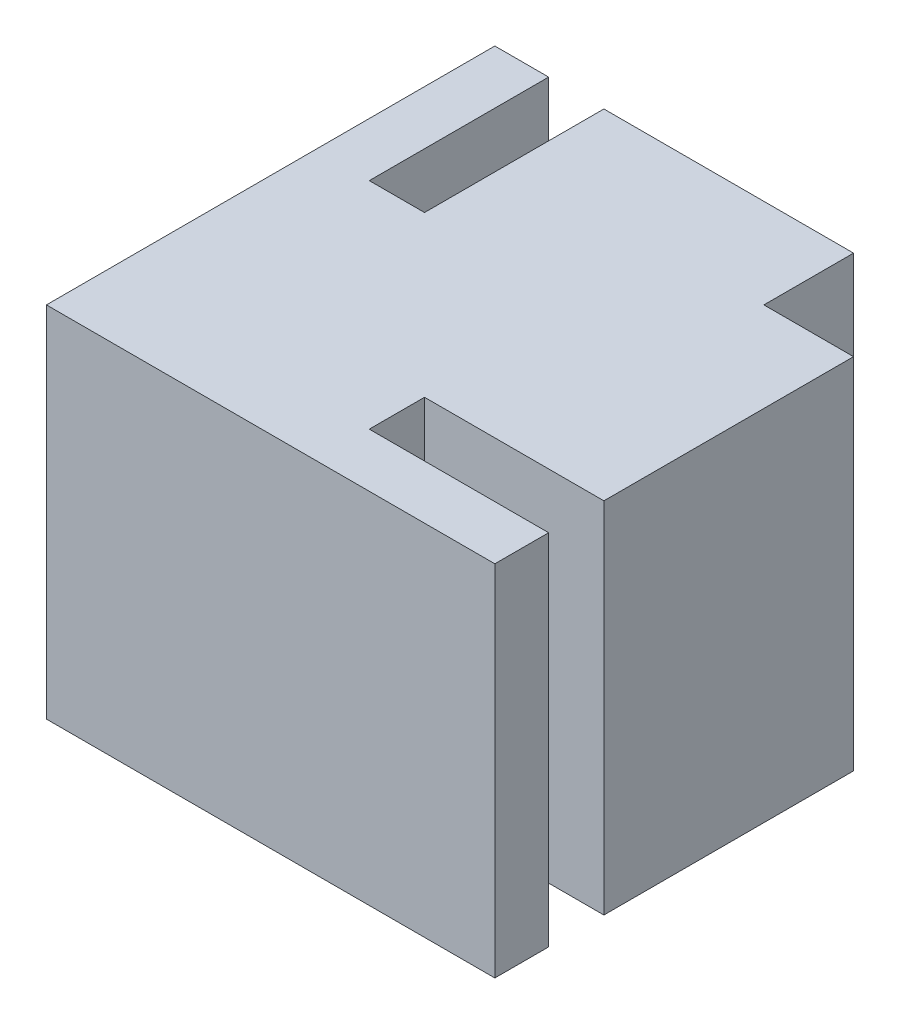
ISO-10303-21;
HEADER;
FILE_DESCRIPTION(('STEP AP214'),'2;1');
FILE_NAME('part.step','',(''),(''),'','','');
FILE_SCHEMA(('AUTOMOTIVE_DESIGN { 1 0 10303 214 1 1 1 1 }'));
ENDSEC;
DATA;
#1=APPLICATION_CONTEXT('core data for automotive mechanical design processes');
#2=APPLICATION_PROTOCOL_DEFINITION('international standard','automotive_design',2000,#1);
#3=PRODUCT_CONTEXT('',#1,'mechanical');
#4=PRODUCT('Part','Part','',(#3));
#5=PRODUCT_RELATED_PRODUCT_CATEGORY('part','',(#4));
#6=PRODUCT_DEFINITION_FORMATION('','',#4);
#7=PRODUCT_DEFINITION_CONTEXT('part definition',#1,'design');
#8=PRODUCT_DEFINITION('design','',#6,#7);
#9=PRODUCT_DEFINITION_SHAPE('','',#8);
#10=(LENGTH_UNIT() NAMED_UNIT(*) SI_UNIT(.MILLI.,.METRE.));
#11=(NAMED_UNIT(*) PLANE_ANGLE_UNIT() SI_UNIT($,.RADIAN.));
#12=(NAMED_UNIT(*) SI_UNIT($,.STERADIAN.) SOLID_ANGLE_UNIT());
#13=UNCERTAINTY_MEASURE_WITH_UNIT(LENGTH_MEASURE(1.E-05),#10,'distance_accuracy_value','');
#14=(GEOMETRIC_REPRESENTATION_CONTEXT(3) GLOBAL_UNCERTAINTY_ASSIGNED_CONTEXT((#13)) GLOBAL_UNIT_ASSIGNED_CONTEXT((#10,
#11,#12)) REPRESENTATION_CONTEXT('',''));
#15=CARTESIAN_POINT('',(0.,0.,0.));
#16=DIRECTION('',(0.,0.,1.));
#17=DIRECTION('',(1.,0.,0.));
#18=AXIS2_PLACEMENT_3D('',#15,#16,#17);
#19=CARTESIAN_POINT('',(12.5,20.,12.5));
#20=DIRECTION('',(-1.,0.,0.));
#21=DIRECTION('',(0.,0.,1.));
#22=AXIS2_PLACEMENT_3D('',#19,#20,#21);
#23=PLANE('',#22);
#24=DIRECTION('',(0.,0.,-1.));
#25=VECTOR('',#24,1.);
#26=CARTESIAN_POINT('',(12.5,0.,12.5));
#27=LINE('',#26,#25);
#28=CARTESIAN_POINT('',(12.5,0.,12.5));
#29=VERTEX_POINT('',#28);
#30=CARTESIAN_POINT('',(12.5,0.,9.5));
#31=VERTEX_POINT('',#30);
#32=EDGE_CURVE('E158',#29,#31,#27,.T.);
#33=ORIENTED_EDGE('',*,*,#32,.T.);
#34=DIRECTION('',(0.,1.,0.));
#35=VECTOR('',#34,1.);
#36=CARTESIAN_POINT('',(12.5,0.,9.5));
#37=LINE('',#36,#35);
#38=CARTESIAN_POINT('',(12.5,20.,9.5));
#39=VERTEX_POINT('',#38);
#40=EDGE_CURVE('E207',#31,#39,#37,.T.);
#41=ORIENTED_EDGE('',*,*,#40,.T.);
#42=DIRECTION('',(0.,0.,-1.));
#43=VECTOR('',#42,1.);
#44=CARTESIAN_POINT('',(12.5,20.,12.5));
#45=LINE('',#44,#43);
#46=CARTESIAN_POINT('',(12.5,20.,12.5));
#47=VERTEX_POINT('',#46);
#48=EDGE_CURVE('E192',#47,#39,#45,.T.);
#49=ORIENTED_EDGE('',*,*,#48,.F.);
#50=DIRECTION('',(0.,-1.,0.));
#51=VECTOR('',#50,1.);
#52=CARTESIAN_POINT('',(12.5,20.,12.5));
#53=LINE('',#52,#51);
#54=EDGE_CURVE('E41',#47,#29,#53,.T.);
#55=ORIENTED_EDGE('',*,*,#54,.T.);
#56=EDGE_LOOP('',(#33,#41,#49,#55));
#57=FACE_BOUND('',#56,.T.);
#58=ADVANCED_FACE('F33',(#57),#23,.F.);
#59=CARTESIAN_POINT('',(-12.5,20.,-12.5));
#60=DIRECTION('',(0.,0.,1.));
#61=DIRECTION('',(1.,0.,0.));
#62=AXIS2_PLACEMENT_3D('',#59,#60,#61);
#63=PLANE('',#62);
#64=DIRECTION('',(-1.,0.,0.));
#65=VECTOR('',#64,1.);
#66=CARTESIAN_POINT('',(-12.5,0.,-12.5));
#67=LINE('',#66,#65);
#68=CARTESIAN_POINT('',(7.5,0.,-12.5));
#69=VERTEX_POINT('',#68);
#70=CARTESIAN_POINT('',(-6.42,0.,-12.5));
#71=VERTEX_POINT('',#70);
#72=EDGE_CURVE('E170',#69,#71,#67,.T.);
#73=ORIENTED_EDGE('',*,*,#72,.T.);
#74=DIRECTION('',(0.,1.,0.));
#75=VECTOR('',#74,1.);
#76=CARTESIAN_POINT('',(-6.42,0.,-12.5));
#77=LINE('',#76,#75);
#78=CARTESIAN_POINT('',(-6.42,20.,-12.5));
#79=VERTEX_POINT('',#78);
#80=EDGE_CURVE('E220',#71,#79,#77,.T.);
#81=ORIENTED_EDGE('',*,*,#80,.T.);
#82=DIRECTION('',(-1.,0.,0.));
#83=VECTOR('',#82,1.);
#84=CARTESIAN_POINT('',(-12.5,20.,-12.5));
#85=LINE('',#84,#83);
#86=CARTESIAN_POINT('',(7.5,20.,-12.5));
#87=VERTEX_POINT('',#86);
#88=EDGE_CURVE('E178',#87,#79,#85,.T.);
#89=ORIENTED_EDGE('',*,*,#88,.F.);
#90=DIRECTION('',(0.,-1.,0.));
#91=VECTOR('',#90,1.);
#92=CARTESIAN_POINT('',(7.5,20.,-12.5));
#93=LINE('',#92,#91);
#94=EDGE_CURVE('E177',#87,#69,#93,.T.);
#95=ORIENTED_EDGE('',*,*,#94,.T.);
#96=EDGE_LOOP('',(#73,#81,#89,#95));
#97=FACE_BOUND('',#96,.T.);
#98=ADVANCED_FACE('F269',(#97),#63,.F.);
#99=CARTESIAN_POINT('',(-12.5,20.,12.5));
#100=DIRECTION('',(1.,0.,0.));
#101=DIRECTION('',(0.,0.,-1.));
#102=AXIS2_PLACEMENT_3D('',#99,#100,#101);
#103=PLANE('',#102);
#104=DIRECTION('',(0.,0.,1.));
#105=VECTOR('',#104,1.);
#106=CARTESIAN_POINT('',(-12.5,0.,12.5));
#107=LINE('',#106,#105);
#108=CARTESIAN_POINT('',(-12.5,0.,-12.5));
#109=VERTEX_POINT('',#108);
#110=CARTESIAN_POINT('',(-12.5,0.,12.5));
#111=VERTEX_POINT('',#110);
#112=EDGE_CURVE('E162',#109,#111,#107,.T.);
#113=ORIENTED_EDGE('',*,*,#112,.T.);
#114=DIRECTION('',(0.,-1.,0.));
#115=VECTOR('',#114,1.);
#116=CARTESIAN_POINT('',(-12.5,20.,12.5));
#117=LINE('',#116,#115);
#118=CARTESIAN_POINT('',(-12.5,20.,12.5));
#119=VERTEX_POINT('',#118);
#120=EDGE_CURVE('E11',#119,#111,#117,.T.);
#121=ORIENTED_EDGE('',*,*,#120,.F.);
#122=DIRECTION('',(0.,0.,1.));
#123=VECTOR('',#122,1.);
#124=CARTESIAN_POINT('',(-12.5,20.,12.5));
#125=LINE('',#124,#123);
#126=CARTESIAN_POINT('',(-12.5,20.,-12.5));
#127=VERTEX_POINT('',#126);
#128=EDGE_CURVE('E173',#127,#119,#125,.T.);
#129=ORIENTED_EDGE('',*,*,#128,.F.);
#130=DIRECTION('',(0.,-1.,0.));
#131=VECTOR('',#130,1.);
#132=CARTESIAN_POINT('',(-12.5,20.,-12.5));
#133=LINE('',#132,#131);
#134=EDGE_CURVE('E174',#127,#109,#133,.T.);
#135=ORIENTED_EDGE('',*,*,#134,.T.);
#136=EDGE_LOOP('',(#113,#121,#129,#135));
#137=FACE_BOUND('',#136,.T.);
#138=ADVANCED_FACE('F35',(#137),#103,.F.);
#139=CARTESIAN_POINT('',(-12.5,20.,12.5));
#140=DIRECTION('',(0.,0.,-1.));
#141=DIRECTION('',(-1.,0.,0.));
#142=AXIS2_PLACEMENT_3D('',#139,#140,#141);
#143=PLANE('',#142);
#144=DIRECTION('',(1.,0.,0.));
#145=VECTOR('',#144,1.);
#146=CARTESIAN_POINT('',(-12.5,0.,12.5));
#147=LINE('',#146,#145);
#148=EDGE_CURVE('E159',#111,#29,#147,.T.);
#149=ORIENTED_EDGE('',*,*,#148,.T.);
#150=ORIENTED_EDGE('',*,*,#54,.F.);
#151=DIRECTION('',(1.,0.,0.));
#152=VECTOR('',#151,1.);
#153=CARTESIAN_POINT('',(-12.5,20.,12.5));
#154=LINE('',#153,#152);
#155=EDGE_CURVE('E237',#119,#47,#154,.T.);
#156=ORIENTED_EDGE('',*,*,#155,.F.);
#157=ORIENTED_EDGE('',*,*,#120,.T.);
#158=EDGE_LOOP('',(#149,#150,#156,#157));
#159=FACE_BOUND('',#158,.T.);
#160=ADVANCED_FACE('F283',(#159),#143,.F.);
#161=CARTESIAN_POINT('',(12.5,20.,6.42));
#162=VERTEX_POINT('',#161);
#163=CARTESIAN_POINT('',(12.5,20.,-7.5));
#164=VERTEX_POINT('',#163);
#165=EDGE_CURVE('E150',#162,#164,#45,.T.);
#166=ORIENTED_EDGE('',*,*,#165,.F.);
#167=DIRECTION('',(0.,1.,0.));
#168=VECTOR('',#167,1.);
#169=CARTESIAN_POINT('',(12.5,0.,6.42));
#170=LINE('',#169,#168);
#171=CARTESIAN_POINT('',(12.5,0.,6.42));
#172=VERTEX_POINT('',#171);
#173=EDGE_CURVE('E137',#172,#162,#170,.T.);
#174=ORIENTED_EDGE('',*,*,#173,.F.);
#175=CARTESIAN_POINT('',(12.5,0.,-7.5));
#176=VERTEX_POINT('',#175);
#177=EDGE_CURVE('E148',#172,#176,#27,.T.);
#178=ORIENTED_EDGE('',*,*,#177,.T.);
#179=DIRECTION('',(0.,-1.,0.));
#180=VECTOR('',#179,1.);
#181=CARTESIAN_POINT('',(12.5,20.,-7.5));
#182=LINE('',#181,#180);
#183=EDGE_CURVE('E184',#164,#176,#182,.T.);
#184=ORIENTED_EDGE('',*,*,#183,.F.);
#185=EDGE_LOOP('',(#166,#174,#178,#184));
#186=FACE_BOUND('',#185,.T.);
#187=ADVANCED_FACE('F146',(#186),#23,.F.);
#188=CARTESIAN_POINT('',(7.5,20.,-7.5));
#189=DIRECTION('',(0.,0.,1.));
#190=DIRECTION('',(1.,0.,0.));
#191=AXIS2_PLACEMENT_3D('',#188,#189,#190);
#192=PLANE('',#191);
#193=DIRECTION('',(-1.,0.,0.));
#194=VECTOR('',#193,1.);
#195=CARTESIAN_POINT('',(7.5,0.,-7.5));
#196=LINE('',#195,#194);
#197=CARTESIAN_POINT('',(7.5,0.,-7.5));
#198=VERTEX_POINT('',#197);
#199=EDGE_CURVE('E157',#176,#198,#196,.T.);
#200=ORIENTED_EDGE('',*,*,#199,.T.);
#201=DIRECTION('',(0.,-1.,0.));
#202=VECTOR('',#201,1.);
#203=CARTESIAN_POINT('',(7.5,20.,-7.5));
#204=LINE('',#203,#202);
#205=CARTESIAN_POINT('',(7.5,20.,-7.5));
#206=VERTEX_POINT('',#205);
#207=EDGE_CURVE('E181',#206,#198,#204,.T.);
#208=ORIENTED_EDGE('',*,*,#207,.F.);
#209=DIRECTION('',(-1.,0.,0.));
#210=VECTOR('',#209,1.);
#211=CARTESIAN_POINT('',(7.5,20.,-7.5));
#212=LINE('',#211,#210);
#213=EDGE_CURVE('E240',#164,#206,#212,.T.);
#214=ORIENTED_EDGE('',*,*,#213,.F.);
#215=ORIENTED_EDGE('',*,*,#183,.T.);
#216=EDGE_LOOP('',(#200,#208,#214,#215));
#217=FACE_BOUND('',#216,.T.);
#218=ADVANCED_FACE('F278',(#217),#192,.F.);
#219=CARTESIAN_POINT('',(7.5,20.,-12.5));
#220=DIRECTION('',(-1.,0.,0.));
#221=DIRECTION('',(0.,0.,1.));
#222=AXIS2_PLACEMENT_3D('',#219,#220,#221);
#223=PLANE('',#222);
#224=DIRECTION('',(0.,0.,-1.));
#225=VECTOR('',#224,1.);
#226=CARTESIAN_POINT('',(7.5,0.,-12.5));
#227=LINE('',#226,#225);
#228=EDGE_CURVE('E167',#198,#69,#227,.T.);
#229=ORIENTED_EDGE('',*,*,#228,.T.);
#230=ORIENTED_EDGE('',*,*,#94,.F.);
#231=DIRECTION('',(0.,0.,-1.));
#232=VECTOR('',#231,1.);
#233=CARTESIAN_POINT('',(7.5,20.,-12.5));
#234=LINE('',#233,#232);
#235=EDGE_CURVE('E242',#206,#87,#234,.T.);
#236=ORIENTED_EDGE('',*,*,#235,.F.);
#237=ORIENTED_EDGE('',*,*,#207,.T.);
#238=EDGE_LOOP('',(#229,#230,#236,#237));
#239=FACE_BOUND('',#238,.T.);
#240=ADVANCED_FACE('F274',(#239),#223,.F.);
#241=CARTESIAN_POINT('',(-9.50000000000001,20.,-12.5));
#242=VERTEX_POINT('',#241);
#243=EDGE_CURVE('E244',#242,#127,#85,.T.);
#244=ORIENTED_EDGE('',*,*,#243,.F.);
#245=DIRECTION('',(0.,1.,0.));
#246=VECTOR('',#245,1.);
#247=CARTESIAN_POINT('',(-9.50000000000001,0.,-12.5));
#248=LINE('',#247,#246);
#249=CARTESIAN_POINT('',(-9.50000000000001,0.,-12.5));
#250=VERTEX_POINT('',#249);
#251=EDGE_CURVE('E231',#250,#242,#248,.T.);
#252=ORIENTED_EDGE('',*,*,#251,.F.);
#253=EDGE_CURVE('E169',#250,#109,#67,.T.);
#254=ORIENTED_EDGE('',*,*,#253,.T.);
#255=ORIENTED_EDGE('',*,*,#134,.F.);
#256=EDGE_LOOP('',(#244,#252,#254,#255));
#257=FACE_BOUND('',#256,.T.);
#258=ADVANCED_FACE('F255',(#257),#63,.F.);
#259=CARTESIAN_POINT('',(0.,20.,0.));
#260=DIRECTION('',(0.,-1.,0.));
#261=DIRECTION('',(0.,0.,-1.));
#262=AXIS2_PLACEMENT_3D('',#259,#260,#261);
#263=PLANE('',#262);
#264=ORIENTED_EDGE('',*,*,#48,.T.);
#265=DIRECTION('',(1.,0.,0.));
#266=VECTOR('',#265,1.);
#267=CARTESIAN_POINT('',(12.5,20.,9.5));
#268=LINE('',#267,#266);
#269=CARTESIAN_POINT('',(2.5,20.,9.5));
#270=VERTEX_POINT('',#269);
#271=EDGE_CURVE('E142',#270,#39,#268,.T.);
#272=ORIENTED_EDGE('',*,*,#271,.F.);
#273=DIRECTION('',(0.,0.,1.));
#274=VECTOR('',#273,1.);
#275=CARTESIAN_POINT('',(2.5,20.,6.42));
#276=LINE('',#275,#274);
#277=CARTESIAN_POINT('',(2.5,20.,6.42));
#278=VERTEX_POINT('',#277);
#279=EDGE_CURVE('E202',#278,#270,#276,.T.);
#280=ORIENTED_EDGE('',*,*,#279,.F.);
#281=DIRECTION('',(-1.,0.,0.));
#282=VECTOR('',#281,1.);
#283=CARTESIAN_POINT('',(12.5,20.,6.42));
#284=LINE('',#283,#282);
#285=EDGE_CURVE('E200',#162,#278,#284,.T.);
#286=ORIENTED_EDGE('',*,*,#285,.F.);
#287=ORIENTED_EDGE('',*,*,#165,.T.);
#288=ORIENTED_EDGE('',*,*,#213,.T.);
#289=ORIENTED_EDGE('',*,*,#235,.T.);
#290=ORIENTED_EDGE('',*,*,#88,.T.);
#291=DIRECTION('',(0.,0.,-1.));
#292=VECTOR('',#291,1.);
#293=CARTESIAN_POINT('',(-6.42,20.,-12.5));
#294=LINE('',#293,#292);
#295=CARTESIAN_POINT('',(-6.42,20.,-2.5));
#296=VERTEX_POINT('',#295);
#297=EDGE_CURVE('E221',#296,#79,#294,.T.);
#298=ORIENTED_EDGE('',*,*,#297,.F.);
#299=DIRECTION('',(1.,0.,0.));
#300=VECTOR('',#299,1.);
#301=CARTESIAN_POINT('',(-6.42,20.,-2.5));
#302=LINE('',#301,#300);
#303=CARTESIAN_POINT('',(-9.50000000000001,20.,-2.5));
#304=VERTEX_POINT('',#303);
#305=EDGE_CURVE('E216',#304,#296,#302,.T.);
#306=ORIENTED_EDGE('',*,*,#305,.F.);
#307=DIRECTION('',(0.,0.,1.));
#308=VECTOR('',#307,1.);
#309=CARTESIAN_POINT('',(-9.50000000000001,20.,-12.5));
#310=LINE('',#309,#308);
#311=EDGE_CURVE('E223',#242,#304,#310,.T.);
#312=ORIENTED_EDGE('',*,*,#311,.F.);
#313=ORIENTED_EDGE('',*,*,#243,.T.);
#314=ORIENTED_EDGE('',*,*,#128,.T.);
#315=ORIENTED_EDGE('',*,*,#155,.T.);
#316=EDGE_LOOP('',(#264,#272,#280,#286,#287,#288,#289,#290,#298,#306,#312,#313,#314,#315));
#317=FACE_BOUND('',#316,.T.);
#318=ADVANCED_FACE('F261',(#317),#263,.F.);
#319=CARTESIAN_POINT('',(0.,0.,0.));
#320=DIRECTION('',(0.,-1.,0.));
#321=DIRECTION('',(0.,0.,-1.));
#322=AXIS2_PLACEMENT_3D('',#319,#320,#321);
#323=PLANE('',#322);
#324=DIRECTION('',(1.,0.,0.));
#325=VECTOR('',#324,1.);
#326=CARTESIAN_POINT('',(12.5,0.,9.5));
#327=LINE('',#326,#325);
#328=CARTESIAN_POINT('',(2.5,0.,9.5));
#329=VERTEX_POINT('',#328);
#330=EDGE_CURVE('E151',#329,#31,#327,.T.);
#331=ORIENTED_EDGE('',*,*,#330,.T.);
#332=ORIENTED_EDGE('',*,*,#32,.F.);
#333=ORIENTED_EDGE('',*,*,#148,.F.);
#334=ORIENTED_EDGE('',*,*,#112,.F.);
#335=ORIENTED_EDGE('',*,*,#253,.F.);
#336=DIRECTION('',(0.,0.,1.));
#337=VECTOR('',#336,1.);
#338=CARTESIAN_POINT('',(-9.50000000000001,0.,-12.5));
#339=LINE('',#338,#337);
#340=CARTESIAN_POINT('',(-9.50000000000001,0.,-2.5));
#341=VERTEX_POINT('',#340);
#342=EDGE_CURVE('E215',#250,#341,#339,.T.);
#343=ORIENTED_EDGE('',*,*,#342,.T.);
#344=DIRECTION('',(1.,0.,0.));
#345=VECTOR('',#344,1.);
#346=CARTESIAN_POINT('',(-6.42,0.,-2.5));
#347=LINE('',#346,#345);
#348=CARTESIAN_POINT('',(-6.42,0.,-2.5));
#349=VERTEX_POINT('',#348);
#350=EDGE_CURVE('E56',#341,#349,#347,.T.);
#351=ORIENTED_EDGE('',*,*,#350,.T.);
#352=DIRECTION('',(0.,0.,-1.));
#353=VECTOR('',#352,1.);
#354=CARTESIAN_POINT('',(-6.42,0.,-12.5));
#355=LINE('',#354,#353);
#356=EDGE_CURVE('E212',#349,#71,#355,.T.);
#357=ORIENTED_EDGE('',*,*,#356,.T.);
#358=ORIENTED_EDGE('',*,*,#72,.F.);
#359=ORIENTED_EDGE('',*,*,#228,.F.);
#360=ORIENTED_EDGE('',*,*,#199,.F.);
#361=ORIENTED_EDGE('',*,*,#177,.F.);
#362=DIRECTION('',(-1.,0.,0.));
#363=VECTOR('',#362,1.);
#364=CARTESIAN_POINT('',(12.5,0.,6.42));
#365=LINE('',#364,#363);
#366=CARTESIAN_POINT('',(2.5,0.,6.42));
#367=VERTEX_POINT('',#366);
#368=EDGE_CURVE('E133',#172,#367,#365,.T.);
#369=ORIENTED_EDGE('',*,*,#368,.T.);
#370=DIRECTION('',(0.,0.,1.));
#371=VECTOR('',#370,1.);
#372=CARTESIAN_POINT('',(2.5,0.,6.42));
#373=LINE('',#372,#371);
#374=EDGE_CURVE('E48',#367,#329,#373,.T.);
#375=ORIENTED_EDGE('',*,*,#374,.T.);
#376=EDGE_LOOP('',(#331,#332,#333,#334,#335,#343,#351,#357,#358,#359,#360,#361,#369,#375));
#377=FACE_BOUND('',#376,.T.);
#378=ADVANCED_FACE('F155',(#377),#323,.T.);
#379=CARTESIAN_POINT('',(-6.42,0.,-12.5));
#380=DIRECTION('',(1.,0.,0.));
#381=DIRECTION('',(0.,0.,-1.));
#382=AXIS2_PLACEMENT_3D('',#379,#380,#381);
#383=PLANE('',#382);
#384=ORIENTED_EDGE('',*,*,#297,.T.);
#385=ORIENTED_EDGE('',*,*,#80,.F.);
#386=ORIENTED_EDGE('',*,*,#356,.F.);
#387=DIRECTION('',(0.,1.,0.));
#388=VECTOR('',#387,1.);
#389=CARTESIAN_POINT('',(-6.42,0.,-2.5));
#390=LINE('',#389,#388);
#391=EDGE_CURVE('E203',#349,#296,#390,.T.);
#392=ORIENTED_EDGE('',*,*,#391,.T.);
#393=EDGE_LOOP('',(#384,#385,#386,#392));
#394=FACE_BOUND('',#393,.T.);
#395=ADVANCED_FACE('F266',(#394),#383,.F.);
#396=CARTESIAN_POINT('',(-6.42,0.,-2.5));
#397=DIRECTION('',(0.,0.,1.));
#398=DIRECTION('',(1.,0.,0.));
#399=AXIS2_PLACEMENT_3D('',#396,#397,#398);
#400=PLANE('',#399);
#401=ORIENTED_EDGE('',*,*,#305,.T.);
#402=ORIENTED_EDGE('',*,*,#391,.F.);
#403=ORIENTED_EDGE('',*,*,#350,.F.);
#404=DIRECTION('',(0.,1.,0.));
#405=VECTOR('',#404,1.);
#406=CARTESIAN_POINT('',(-9.50000000000001,0.,-2.5));
#407=LINE('',#406,#405);
#408=EDGE_CURVE('E229',#341,#304,#407,.T.);
#409=ORIENTED_EDGE('',*,*,#408,.T.);
#410=EDGE_LOOP('',(#401,#402,#403,#409));
#411=FACE_BOUND('',#410,.T.);
#412=ADVANCED_FACE('F263',(#411),#400,.F.);
#413=CARTESIAN_POINT('',(-9.50000000000001,0.,-12.5));
#414=DIRECTION('',(-1.,0.,0.));
#415=DIRECTION('',(0.,0.,1.));
#416=AXIS2_PLACEMENT_3D('',#413,#414,#415);
#417=PLANE('',#416);
#418=ORIENTED_EDGE('',*,*,#311,.T.);
#419=ORIENTED_EDGE('',*,*,#408,.F.);
#420=ORIENTED_EDGE('',*,*,#342,.F.);
#421=ORIENTED_EDGE('',*,*,#251,.T.);
#422=EDGE_LOOP('',(#418,#419,#420,#421));
#423=FACE_BOUND('',#422,.T.);
#424=ADVANCED_FACE('F258',(#423),#417,.F.);
#425=CARTESIAN_POINT('',(12.5,0.,9.5));
#426=DIRECTION('',(0.,0.,1.));
#427=DIRECTION('',(1.,0.,0.));
#428=AXIS2_PLACEMENT_3D('',#425,#426,#427);
#429=PLANE('',#428);
#430=ORIENTED_EDGE('',*,*,#271,.T.);
#431=ORIENTED_EDGE('',*,*,#40,.F.);
#432=ORIENTED_EDGE('',*,*,#330,.F.);
#433=DIRECTION('',(0.,1.,0.));
#434=VECTOR('',#433,1.);
#435=CARTESIAN_POINT('',(2.5,0.,9.5));
#436=LINE('',#435,#434);
#437=EDGE_CURVE('E209',#329,#270,#436,.T.);
#438=ORIENTED_EDGE('',*,*,#437,.T.);
#439=EDGE_LOOP('',(#430,#431,#432,#438));
#440=FACE_BOUND('',#439,.T.);
#441=ADVANCED_FACE('F282',(#440),#429,.F.);
#442=CARTESIAN_POINT('',(2.5,0.,6.42));
#443=DIRECTION('',(-1.,0.,0.));
#444=DIRECTION('',(0.,0.,1.));
#445=AXIS2_PLACEMENT_3D('',#442,#443,#444);
#446=PLANE('',#445);
#447=ORIENTED_EDGE('',*,*,#279,.T.);
#448=ORIENTED_EDGE('',*,*,#437,.F.);
#449=ORIENTED_EDGE('',*,*,#374,.F.);
#450=DIRECTION('',(0.,1.,0.));
#451=VECTOR('',#450,1.);
#452=CARTESIAN_POINT('',(2.5,0.,6.42));
#453=LINE('',#452,#451);
#454=EDGE_CURVE('E139',#367,#278,#453,.T.);
#455=ORIENTED_EDGE('',*,*,#454,.T.);
#456=EDGE_LOOP('',(#447,#448,#449,#455));
#457=FACE_BOUND('',#456,.T.);
#458=ADVANCED_FACE('F281',(#457),#446,.F.);
#459=CARTESIAN_POINT('',(12.5,0.,6.42));
#460=DIRECTION('',(0.,0.,-1.));
#461=DIRECTION('',(-1.,0.,0.));
#462=AXIS2_PLACEMENT_3D('',#459,#460,#461);
#463=PLANE('',#462);
#464=ORIENTED_EDGE('',*,*,#285,.T.);
#465=ORIENTED_EDGE('',*,*,#454,.F.);
#466=ORIENTED_EDGE('',*,*,#368,.F.);
#467=ORIENTED_EDGE('',*,*,#173,.T.);
#468=EDGE_LOOP('',(#464,#465,#466,#467));
#469=FACE_BOUND('',#468,.T.);
#470=ADVANCED_FACE('F136',(#469),#463,.F.);
#471=CLOSED_SHELL('',(#58,#98,#138,#160,#187,#218,#240,#258,#318,#378,#395,#412,#424,#441,#458,#470));
#472=MANIFOLD_SOLID_BREP('B2',#471);
#473=ADVANCED_BREP_SHAPE_REPRESENTATION('',(#18,#472),#14);
#474=SHAPE_DEFINITION_REPRESENTATION(#9,#473);
ENDSEC;
END-ISO-10303-21;
